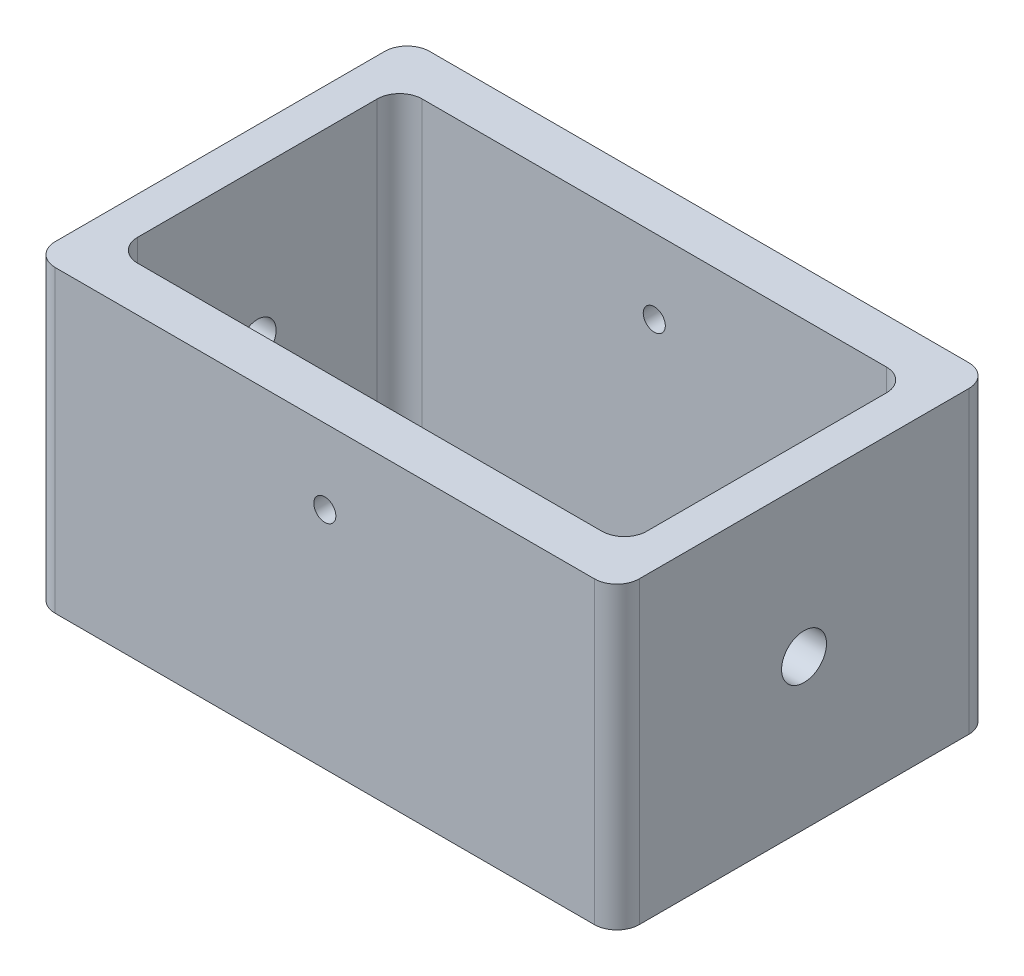
ISO-10303-21;
HEADER;
FILE_DESCRIPTION(('STEP AP214'),'2;1');
FILE_NAME('part.step','',(''),(''),'','','');
FILE_SCHEMA(('AUTOMOTIVE_DESIGN { 1 0 10303 214 1 1 1 1 }'));
ENDSEC;
DATA;
#1=APPLICATION_CONTEXT('core data for automotive mechanical design processes');
#2=APPLICATION_PROTOCOL_DEFINITION('international standard','automotive_design',2000,#1);
#3=PRODUCT_CONTEXT('',#1,'mechanical');
#4=PRODUCT('Part','Part','',(#3));
#5=PRODUCT_RELATED_PRODUCT_CATEGORY('part','',(#4));
#6=PRODUCT_DEFINITION_FORMATION('','',#4);
#7=PRODUCT_DEFINITION_CONTEXT('part definition',#1,'design');
#8=PRODUCT_DEFINITION('design','',#6,#7);
#9=PRODUCT_DEFINITION_SHAPE('','',#8);
#10=(LENGTH_UNIT() NAMED_UNIT(*) SI_UNIT(.MILLI.,.METRE.));
#11=(NAMED_UNIT(*) PLANE_ANGLE_UNIT() SI_UNIT($,.RADIAN.));
#12=(NAMED_UNIT(*) SI_UNIT($,.STERADIAN.) SOLID_ANGLE_UNIT());
#13=UNCERTAINTY_MEASURE_WITH_UNIT(LENGTH_MEASURE(1.E-05),#10,'distance_accuracy_value','');
#14=(GEOMETRIC_REPRESENTATION_CONTEXT(3) GLOBAL_UNCERTAINTY_ASSIGNED_CONTEXT((#13)) GLOBAL_UNIT_ASSIGNED_CONTEXT((#10,
#11,#12)) REPRESENTATION_CONTEXT('',''));
#15=CARTESIAN_POINT('',(0.,0.,0.));
#16=DIRECTION('',(0.,0.,1.));
#17=DIRECTION('',(1.,0.,0.));
#18=AXIS2_PLACEMENT_3D('',#15,#16,#17);
#19=CARTESIAN_POINT('',(0.,40.,0.));
#20=DIRECTION('',(0.,-1.,0.));
#21=DIRECTION('',(0.,0.,-1.));
#22=AXIS2_PLACEMENT_3D('',#19,#20,#21);
#23=PLANE('',#22);
#24=DIRECTION('',(0.,0.,-1.));
#25=VECTOR('',#24,1.);
#26=CARTESIAN_POINT('',(63.5813694545739,40.,-30.2037926413092));
#27=LINE('',#26,#25);
#28=CARTESIAN_POINT('',(63.5813694545739,40.,16.7962073586908));
#29=VERTEX_POINT('',#28);
#30=CARTESIAN_POINT('',(63.5813694545739,40.,-27.2037926413092));
#31=VERTEX_POINT('',#30);
#32=EDGE_CURVE('E346',#29,#31,#27,.T.);
#33=ORIENTED_EDGE('',*,*,#32,.T.);
#34=CARTESIAN_POINT('',(60.5813694545739,40.,-27.2037926413092));
#35=DIRECTION('',(0.,-1.,0.));
#36=DIRECTION('',(0.,0.,-1.));
#37=AXIS2_PLACEMENT_3D('',#34,#35,#36);
#38=CIRCLE('',#37,3.);
#39=CARTESIAN_POINT('',(60.5813694545739,40.,-30.2037926413092));
#40=VERTEX_POINT('',#39);
#41=EDGE_CURVE('E225',#31,#40,#38,.F.);
#42=ORIENTED_EDGE('',*,*,#41,.T.);
#43=DIRECTION('',(-1.,0.,0.));
#44=VECTOR('',#43,1.);
#45=CARTESIAN_POINT('',(-14.4186305454261,40.,-30.2037926413092));
#46=LINE('',#45,#44);
#47=CARTESIAN_POINT('',(-11.4186305454261,40.,-30.2037926413092));
#48=VERTEX_POINT('',#47);
#49=EDGE_CURVE('E180',#40,#48,#46,.T.);
#50=ORIENTED_EDGE('',*,*,#49,.T.);
#51=CARTESIAN_POINT('',(-11.4186305454261,40.,-27.2037926413092));
#52=DIRECTION('',(0.,-1.,0.));
#53=DIRECTION('',(0.,0.,-1.));
#54=AXIS2_PLACEMENT_3D('',#51,#52,#53);
#55=CIRCLE('',#54,3.);
#56=CARTESIAN_POINT('',(-14.4186305454261,40.,-27.2037926413092));
#57=VERTEX_POINT('',#56);
#58=EDGE_CURVE('E222',#48,#57,#55,.F.);
#59=ORIENTED_EDGE('',*,*,#58,.T.);
#60=DIRECTION('',(0.,0.,1.));
#61=VECTOR('',#60,1.);
#62=CARTESIAN_POINT('',(-14.4186305454261,40.,19.7962073586908));
#63=LINE('',#62,#61);
#64=CARTESIAN_POINT('',(-14.4186305454261,40.,16.7962073586908));
#65=VERTEX_POINT('',#64);
#66=EDGE_CURVE('E202',#57,#65,#63,.T.);
#67=ORIENTED_EDGE('',*,*,#66,.T.);
#68=CARTESIAN_POINT('',(-11.4186305454261,40.,16.7962073586908));
#69=DIRECTION('',(0.,-1.,0.));
#70=DIRECTION('',(0.,0.,-1.));
#71=AXIS2_PLACEMENT_3D('',#68,#69,#70);
#72=CIRCLE('',#71,3.);
#73=CARTESIAN_POINT('',(-11.4186305454261,40.,19.7962073586908));
#74=VERTEX_POINT('',#73);
#75=EDGE_CURVE('E219',#65,#74,#72,.F.);
#76=ORIENTED_EDGE('',*,*,#75,.T.);
#77=DIRECTION('',(1.,0.,0.));
#78=VECTOR('',#77,1.);
#79=CARTESIAN_POINT('',(63.5813694545739,40.,19.7962073586908));
#80=LINE('',#79,#78);
#81=CARTESIAN_POINT('',(60.5813694545739,40.,19.7962073586908));
#82=VERTEX_POINT('',#81);
#83=EDGE_CURVE('E195',#74,#82,#80,.T.);
#84=ORIENTED_EDGE('',*,*,#83,.T.);
#85=CARTESIAN_POINT('',(60.5813694545739,40.,16.7962073586908));
#86=DIRECTION('',(0.,-1.,0.));
#87=DIRECTION('',(0.,0.,-1.));
#88=AXIS2_PLACEMENT_3D('',#85,#86,#87);
#89=CIRCLE('',#88,3.);
#90=EDGE_CURVE('E216',#82,#29,#89,.F.);
#91=ORIENTED_EDGE('',*,*,#90,.T.);
#92=EDGE_LOOP('',(#33,#42,#50,#59,#67,#76,#84,#91));
#93=FACE_BOUND('',#92,.T.);
#94=DIRECTION('',(-1.,0.,0.));
#95=VECTOR('',#94,1.);
#96=CARTESIAN_POINT('',(58.5813694545739,40.,-24.2037926413092));
#97=LINE('',#96,#95);
#98=CARTESIAN_POINT('',(55.5813694545739,40.,-24.2037926413092));
#99=VERTEX_POINT('',#98);
#100=CARTESIAN_POINT('',(-6.41863054542609,40.,-24.2037926413092));
#101=VERTEX_POINT('',#100);
#102=EDGE_CURVE('E313',#99,#101,#97,.T.);
#103=ORIENTED_EDGE('',*,*,#102,.F.);
#104=CARTESIAN_POINT('',(55.5813694545739,40.,-21.2037926413092));
#105=DIRECTION('',(0.,-1.,0.));
#106=DIRECTION('',(0.,0.,-1.));
#107=AXIS2_PLACEMENT_3D('',#104,#105,#106);
#108=CIRCLE('',#107,3.);
#109=CARTESIAN_POINT('',(58.5813694545739,40.,-21.2037926413092));
#110=VERTEX_POINT('',#109);
#111=EDGE_CURVE('E272',#99,#110,#108,.T.);
#112=ORIENTED_EDGE('',*,*,#111,.T.);
#113=DIRECTION('',(0.,0.,-1.));
#114=VECTOR('',#113,1.);
#115=CARTESIAN_POINT('',(58.5813694545739,40.,13.7962073586908));
#116=LINE('',#115,#114);
#117=CARTESIAN_POINT('',(58.5813694545739,40.,10.7962073586908));
#118=VERTEX_POINT('',#117);
#119=EDGE_CURVE('E325',#118,#110,#116,.T.);
#120=ORIENTED_EDGE('',*,*,#119,.F.);
#121=CARTESIAN_POINT('',(55.5813694545739,40.,10.7962073586908));
#122=DIRECTION('',(0.,-1.,0.));
#123=DIRECTION('',(0.,0.,-1.));
#124=AXIS2_PLACEMENT_3D('',#121,#122,#123);
#125=CIRCLE('',#124,3.);
#126=CARTESIAN_POINT('',(55.5813694545739,40.,13.7962073586908));
#127=VERTEX_POINT('',#126);
#128=EDGE_CURVE('E11',#118,#127,#125,.T.);
#129=ORIENTED_EDGE('',*,*,#128,.T.);
#130=DIRECTION('',(1.,0.,0.));
#131=VECTOR('',#130,1.);
#132=CARTESIAN_POINT('',(-9.41863054542609,40.,13.7962073586908));
#133=LINE('',#132,#131);
#134=CARTESIAN_POINT('',(-6.41863054542609,40.,13.7962073586908));
#135=VERTEX_POINT('',#134);
#136=EDGE_CURVE('E321',#135,#127,#133,.T.);
#137=ORIENTED_EDGE('',*,*,#136,.F.);
#138=CARTESIAN_POINT('',(-6.41863054542609,40.,10.7962073586908));
#139=DIRECTION('',(0.,-1.,0.));
#140=DIRECTION('',(0.,0.,-1.));
#141=AXIS2_PLACEMENT_3D('',#138,#139,#140);
#142=CIRCLE('',#141,3.);
#143=CARTESIAN_POINT('',(-9.41863054542609,40.,10.7962073586908));
#144=VERTEX_POINT('',#143);
#145=EDGE_CURVE('E60',#135,#144,#142,.T.);
#146=ORIENTED_EDGE('',*,*,#145,.T.);
#147=DIRECTION('',(0.,0.,1.));
#148=VECTOR('',#147,1.);
#149=CARTESIAN_POINT('',(-9.41863054542609,40.,-24.2037926413092));
#150=LINE('',#149,#148);
#151=CARTESIAN_POINT('',(-9.41863054542609,40.,-21.2037926413092));
#152=VERTEX_POINT('',#151);
#153=EDGE_CURVE('E317',#152,#144,#150,.T.);
#154=ORIENTED_EDGE('',*,*,#153,.F.);
#155=CARTESIAN_POINT('',(-6.41863054542609,40.,-21.2037926413092));
#156=DIRECTION('',(0.,-1.,0.));
#157=DIRECTION('',(0.,0.,-1.));
#158=AXIS2_PLACEMENT_3D('',#155,#156,#157);
#159=CIRCLE('',#158,3.);
#160=EDGE_CURVE('E278',#152,#101,#159,.T.);
#161=ORIENTED_EDGE('',*,*,#160,.T.);
#162=EDGE_LOOP('',(#103,#112,#120,#129,#137,#146,#154,#161));
#163=FACE_BOUND('',#162,.T.);
#164=ADVANCED_FACE('F42',(#93,#163),#23,.F.);
#165=CARTESIAN_POINT('',(0.,0.,0.));
#166=DIRECTION('',(0.,-1.,0.));
#167=DIRECTION('',(0.,0.,-1.));
#168=AXIS2_PLACEMENT_3D('',#165,#166,#167);
#169=PLANE('',#168);
#170=DIRECTION('',(-1.,0.,0.));
#171=VECTOR('',#170,1.);
#172=CARTESIAN_POINT('',(-14.4186305454261,0.,-30.2037926413092));
#173=LINE('',#172,#171);
#174=CARTESIAN_POINT('',(60.5813694545739,0.,-30.2037926413092));
#175=VERTEX_POINT('',#174);
#176=CARTESIAN_POINT('',(-11.4186305454261,0.,-30.2037926413092));
#177=VERTEX_POINT('',#176);
#178=EDGE_CURVE('E177',#175,#177,#173,.T.);
#179=ORIENTED_EDGE('',*,*,#178,.F.);
#180=CARTESIAN_POINT('',(60.5813694545739,0.,-27.2037926413092));
#181=DIRECTION('',(0.,-1.,0.));
#182=DIRECTION('',(0.,0.,-1.));
#183=AXIS2_PLACEMENT_3D('',#180,#181,#182);
#184=CIRCLE('',#183,3.);
#185=CARTESIAN_POINT('',(63.5813694545739,0.,-27.2037926413092));
#186=VERTEX_POINT('',#185);
#187=EDGE_CURVE('E159',#175,#186,#184,.T.);
#188=ORIENTED_EDGE('',*,*,#187,.T.);
#189=DIRECTION('',(0.,0.,-1.));
#190=VECTOR('',#189,1.);
#191=CARTESIAN_POINT('',(63.5813694545739,0.,-30.2037926413092));
#192=LINE('',#191,#190);
#193=CARTESIAN_POINT('',(63.5813694545739,0.,16.7962073586908));
#194=VERTEX_POINT('',#193);
#195=EDGE_CURVE('E190',#194,#186,#192,.T.);
#196=ORIENTED_EDGE('',*,*,#195,.F.);
#197=CARTESIAN_POINT('',(60.5813694545739,0.,16.7962073586908));
#198=DIRECTION('',(0.,-1.,0.));
#199=DIRECTION('',(0.,0.,-1.));
#200=AXIS2_PLACEMENT_3D('',#197,#198,#199);
#201=CIRCLE('',#200,3.);
#202=CARTESIAN_POINT('',(60.5813694545739,0.,19.7962073586908));
#203=VERTEX_POINT('',#202);
#204=EDGE_CURVE('E182',#194,#203,#201,.T.);
#205=ORIENTED_EDGE('',*,*,#204,.T.);
#206=DIRECTION('',(1.,0.,0.));
#207=VECTOR('',#206,1.);
#208=CARTESIAN_POINT('',(63.5813694545739,0.,19.7962073586908));
#209=LINE('',#208,#207);
#210=CARTESIAN_POINT('',(-11.4186305454261,0.,19.7962073586908));
#211=VERTEX_POINT('',#210);
#212=EDGE_CURVE('E197',#211,#203,#209,.T.);
#213=ORIENTED_EDGE('',*,*,#212,.F.);
#214=CARTESIAN_POINT('',(-11.4186305454261,0.,16.7962073586908));
#215=DIRECTION('',(0.,-1.,0.));
#216=DIRECTION('',(0.,0.,-1.));
#217=AXIS2_PLACEMENT_3D('',#214,#215,#216);
#218=CIRCLE('',#217,3.);
#219=CARTESIAN_POINT('',(-14.4186305454261,0.,16.7962073586908));
#220=VERTEX_POINT('',#219);
#221=EDGE_CURVE('E206',#211,#220,#218,.T.);
#222=ORIENTED_EDGE('',*,*,#221,.T.);
#223=DIRECTION('',(0.,0.,1.));
#224=VECTOR('',#223,1.);
#225=CARTESIAN_POINT('',(-14.4186305454261,0.,19.7962073586908));
#226=LINE('',#225,#224);
#227=CARTESIAN_POINT('',(-14.4186305454261,0.,-27.2037926413092));
#228=VERTEX_POINT('',#227);
#229=EDGE_CURVE('E189',#228,#220,#226,.T.);
#230=ORIENTED_EDGE('',*,*,#229,.F.);
#231=CARTESIAN_POINT('',(-11.4186305454261,0.,-27.2037926413092));
#232=DIRECTION('',(0.,-1.,0.));
#233=DIRECTION('',(0.,0.,-1.));
#234=AXIS2_PLACEMENT_3D('',#231,#232,#233);
#235=CIRCLE('',#234,3.);
#236=EDGE_CURVE('E171',#228,#177,#235,.T.);
#237=ORIENTED_EDGE('',*,*,#236,.T.);
#238=EDGE_LOOP('',(#179,#188,#196,#205,#213,#222,#230,#237));
#239=FACE_BOUND('',#238,.T.);
#240=DIRECTION('',(1.,0.,0.));
#241=VECTOR('',#240,1.);
#242=CARTESIAN_POINT('',(-9.41863054542609,0.,13.7962073586908));
#243=LINE('',#242,#241);
#244=CARTESIAN_POINT('',(-6.41863054542609,0.,13.7962073586908));
#245=VERTEX_POINT('',#244);
#246=CARTESIAN_POINT('',(55.5813694545739,0.,13.7962073586908));
#247=VERTEX_POINT('',#246);
#248=EDGE_CURVE('E336',#245,#247,#243,.T.);
#249=ORIENTED_EDGE('',*,*,#248,.T.);
#250=CARTESIAN_POINT('',(55.5813694545739,0.,10.7962073586908));
#251=DIRECTION('',(0.,-1.,0.));
#252=DIRECTION('',(0.,0.,-1.));
#253=AXIS2_PLACEMENT_3D('',#250,#251,#252);
#254=CIRCLE('',#253,3.);
#255=CARTESIAN_POINT('',(58.5813694545739,0.,10.7962073586908));
#256=VERTEX_POINT('',#255);
#257=EDGE_CURVE('E52',#247,#256,#254,.F.);
#258=ORIENTED_EDGE('',*,*,#257,.T.);
#259=DIRECTION('',(0.,0.,-1.));
#260=VECTOR('',#259,1.);
#261=CARTESIAN_POINT('',(58.5813694545739,0.,13.7962073586908));
#262=LINE('',#261,#260);
#263=CARTESIAN_POINT('',(58.5813694545739,0.,-21.2037926413092));
#264=VERTEX_POINT('',#263);
#265=EDGE_CURVE('E318',#256,#264,#262,.T.);
#266=ORIENTED_EDGE('',*,*,#265,.T.);
#267=CARTESIAN_POINT('',(55.5813694545739,0.,-21.2037926413092));
#268=DIRECTION('',(0.,-1.,0.));
#269=DIRECTION('',(0.,0.,-1.));
#270=AXIS2_PLACEMENT_3D('',#267,#268,#269);
#271=CIRCLE('',#270,3.);
#272=CARTESIAN_POINT('',(55.5813694545739,0.,-24.2037926413092));
#273=VERTEX_POINT('',#272);
#274=EDGE_CURVE('E269',#264,#273,#271,.F.);
#275=ORIENTED_EDGE('',*,*,#274,.T.);
#276=DIRECTION('',(-1.,0.,0.));
#277=VECTOR('',#276,1.);
#278=CARTESIAN_POINT('',(58.5813694545739,0.,-24.2037926413092));
#279=LINE('',#278,#277);
#280=CARTESIAN_POINT('',(-6.41863054542609,0.,-24.2037926413092));
#281=VERTEX_POINT('',#280);
#282=EDGE_CURVE('E291',#273,#281,#279,.T.);
#283=ORIENTED_EDGE('',*,*,#282,.T.);
#284=CARTESIAN_POINT('',(-6.41863054542609,0.,-21.2037926413092));
#285=DIRECTION('',(0.,-1.,0.));
#286=DIRECTION('',(0.,0.,-1.));
#287=AXIS2_PLACEMENT_3D('',#284,#285,#286);
#288=CIRCLE('',#287,3.);
#289=CARTESIAN_POINT('',(-9.41863054542609,0.,-21.2037926413092));
#290=VERTEX_POINT('',#289);
#291=EDGE_CURVE('E275',#281,#290,#288,.F.);
#292=ORIENTED_EDGE('',*,*,#291,.T.);
#293=DIRECTION('',(0.,0.,1.));
#294=VECTOR('',#293,1.);
#295=CARTESIAN_POINT('',(-9.41863054542609,0.,-24.2037926413092));
#296=LINE('',#295,#294);
#297=CARTESIAN_POINT('',(-9.41863054542609,0.,10.7962073586908));
#298=VERTEX_POINT('',#297);
#299=EDGE_CURVE('E332',#290,#298,#296,.T.);
#300=ORIENTED_EDGE('',*,*,#299,.T.);
#301=CARTESIAN_POINT('',(-6.41863054542609,0.,10.7962073586908));
#302=DIRECTION('',(0.,-1.,0.));
#303=DIRECTION('',(0.,0.,-1.));
#304=AXIS2_PLACEMENT_3D('',#301,#302,#303);
#305=CIRCLE('',#304,3.);
#306=EDGE_CURVE('E281',#298,#245,#305,.F.);
#307=ORIENTED_EDGE('',*,*,#306,.T.);
#308=EDGE_LOOP('',(#249,#258,#266,#275,#283,#292,#300,#307));
#309=FACE_BOUND('',#308,.T.);
#310=ADVANCED_FACE('F185',(#239,#309),#169,.T.);
#311=CARTESIAN_POINT('',(63.5813694545739,40.,19.7962073586908));
#312=DIRECTION('',(0.,0.,-1.));
#313=DIRECTION('',(-1.,0.,0.));
#314=AXIS2_PLACEMENT_3D('',#311,#312,#313);
#315=PLANE('',#314);
#316=CARTESIAN_POINT('',(24.5813694545739,30.,19.7962073586908));
#317=DIRECTION('',(0.,0.,-1.));
#318=DIRECTION('',(-1.,0.,0.));
#319=AXIS2_PLACEMENT_3D('',#316,#317,#318);
#320=CIRCLE('',#319,1.475);
#321=CARTESIAN_POINT('',(23.1063694545739,30.,19.7962073586908));
#322=VERTEX_POINT('',#321);
#323=EDGE_CURVE('E651',#322,#322,#320,.T.);
#324=ORIENTED_EDGE('',*,*,#323,.T.);
#325=EDGE_LOOP('',(#324));
#326=FACE_BOUND('',#325,.T.);
#327=ORIENTED_EDGE('',*,*,#83,.F.);
#328=DIRECTION('',(0.,-1.,0.));
#329=VECTOR('',#328,1.);
#330=CARTESIAN_POINT('',(-11.4186305454261,40.,19.7962073586908));
#331=LINE('',#330,#329);
#332=EDGE_CURVE('E238',#74,#211,#331,.T.);
#333=ORIENTED_EDGE('',*,*,#332,.T.);
#334=ORIENTED_EDGE('',*,*,#212,.T.);
#335=DIRECTION('',(0.,-1.,0.));
#336=VECTOR('',#335,1.);
#337=CARTESIAN_POINT('',(60.5813694545739,40.,19.7962073586908));
#338=LINE('',#337,#336);
#339=EDGE_CURVE('E235',#203,#82,#338,.F.);
#340=ORIENTED_EDGE('',*,*,#339,.T.);
#341=EDGE_LOOP('',(#327,#333,#334,#340));
#342=FACE_BOUND('',#341,.T.);
#343=ADVANCED_FACE('F360',(#326,#342),#315,.F.);
#344=CARTESIAN_POINT('',(63.5813694545739,40.,-30.2037926413092));
#345=DIRECTION('',(-1.,0.,0.));
#346=DIRECTION('',(0.,0.,1.));
#347=AXIS2_PLACEMENT_3D('',#344,#345,#346);
#348=PLANE('',#347);
#349=CARTESIAN_POINT('',(63.5813694545739,20.,-5.20379264130917));
#350=DIRECTION('',(1.,0.,0.));
#351=DIRECTION('',(0.,0.,-1.));
#352=AXIS2_PLACEMENT_3D('',#349,#350,#351);
#353=CIRCLE('',#352,3.);
#354=CARTESIAN_POINT('',(63.5813694545739,20.,-8.20379264130917));
#355=VERTEX_POINT('',#354);
#356=EDGE_CURVE('E292',#355,#355,#353,.T.);
#357=ORIENTED_EDGE('',*,*,#356,.F.);
#358=EDGE_LOOP('',(#357));
#359=FACE_BOUND('',#358,.T.);
#360=ORIENTED_EDGE('',*,*,#195,.T.);
#361=DIRECTION('',(0.,-1.,0.));
#362=VECTOR('',#361,1.);
#363=CARTESIAN_POINT('',(63.5813694545739,40.,-27.2037926413092));
#364=LINE('',#363,#362);
#365=EDGE_CURVE('E164',#186,#31,#364,.F.);
#366=ORIENTED_EDGE('',*,*,#365,.T.);
#367=ORIENTED_EDGE('',*,*,#32,.F.);
#368=DIRECTION('',(0.,-1.,0.));
#369=VECTOR('',#368,1.);
#370=CARTESIAN_POINT('',(63.5813694545739,40.,16.7962073586908));
#371=LINE('',#370,#369);
#372=EDGE_CURVE('E170',#29,#194,#371,.T.);
#373=ORIENTED_EDGE('',*,*,#372,.T.);
#374=EDGE_LOOP('',(#360,#366,#367,#373));
#375=FACE_BOUND('',#374,.T.);
#376=ADVANCED_FACE('F368',(#359,#375),#348,.F.);
#377=CARTESIAN_POINT('',(-14.4186305454261,40.,-30.2037926413092));
#378=DIRECTION('',(0.,0.,1.));
#379=DIRECTION('',(1.,0.,0.));
#380=AXIS2_PLACEMENT_3D('',#377,#378,#379);
#381=PLANE('',#380);
#382=CARTESIAN_POINT('',(24.5813694545739,30.,-30.2037926413092));
#383=DIRECTION('',(0.,0.,-1.));
#384=DIRECTION('',(-1.,0.,0.));
#385=AXIS2_PLACEMENT_3D('',#382,#383,#384);
#386=CIRCLE('',#385,1.475);
#387=CARTESIAN_POINT('',(23.1063694545739,30.,-30.2037926413092));
#388=VERTEX_POINT('',#387);
#389=EDGE_CURVE('E649',#388,#388,#386,.T.);
#390=ORIENTED_EDGE('',*,*,#389,.F.);
#391=EDGE_LOOP('',(#390));
#392=FACE_BOUND('',#391,.T.);
#393=ORIENTED_EDGE('',*,*,#49,.F.);
#394=DIRECTION('',(0.,-1.,0.));
#395=VECTOR('',#394,1.);
#396=CARTESIAN_POINT('',(60.5813694545739,40.,-30.2037926413092));
#397=LINE('',#396,#395);
#398=EDGE_CURVE('E163',#40,#175,#397,.T.);
#399=ORIENTED_EDGE('',*,*,#398,.T.);
#400=ORIENTED_EDGE('',*,*,#178,.T.);
#401=DIRECTION('',(0.,-1.,0.));
#402=VECTOR('',#401,1.);
#403=CARTESIAN_POINT('',(-11.4186305454261,40.,-30.2037926413092));
#404=LINE('',#403,#402);
#405=EDGE_CURVE('E183',#177,#48,#404,.F.);
#406=ORIENTED_EDGE('',*,*,#405,.T.);
#407=EDGE_LOOP('',(#393,#399,#400,#406));
#408=FACE_BOUND('',#407,.T.);
#409=ADVANCED_FACE('F176',(#392,#408),#381,.F.);
#410=CARTESIAN_POINT('',(-14.4186305454261,40.,19.7962073586908));
#411=DIRECTION('',(1.,0.,0.));
#412=DIRECTION('',(0.,0.,-1.));
#413=AXIS2_PLACEMENT_3D('',#410,#411,#412);
#414=PLANE('',#413);
#415=CARTESIAN_POINT('',(-14.4186305454261,20.,-5.20379264130917));
#416=DIRECTION('',(-1.,0.,0.));
#417=DIRECTION('',(0.,0.,1.));
#418=AXIS2_PLACEMENT_3D('',#415,#416,#417);
#419=CIRCLE('',#418,2.5);
#420=CARTESIAN_POINT('',(-14.4186305454261,20.,-2.70379264130917));
#421=VERTEX_POINT('',#420);
#422=EDGE_CURVE('E296',#421,#421,#419,.T.);
#423=ORIENTED_EDGE('',*,*,#422,.F.);
#424=EDGE_LOOP('',(#423));
#425=FACE_BOUND('',#424,.T.);
#426=ORIENTED_EDGE('',*,*,#66,.F.);
#427=DIRECTION('',(0.,-1.,0.));
#428=VECTOR('',#427,1.);
#429=CARTESIAN_POINT('',(-14.4186305454261,40.,-27.2037926413092));
#430=LINE('',#429,#428);
#431=EDGE_CURVE('E231',#57,#228,#430,.T.);
#432=ORIENTED_EDGE('',*,*,#431,.T.);
#433=ORIENTED_EDGE('',*,*,#229,.T.);
#434=DIRECTION('',(0.,-1.,0.));
#435=VECTOR('',#434,1.);
#436=CARTESIAN_POINT('',(-14.4186305454261,40.,16.7962073586908));
#437=LINE('',#436,#435);
#438=EDGE_CURVE('E228',#220,#65,#437,.F.);
#439=ORIENTED_EDGE('',*,*,#438,.T.);
#440=EDGE_LOOP('',(#426,#432,#433,#439));
#441=FACE_BOUND('',#440,.T.);
#442=ADVANCED_FACE('F376',(#425,#441),#414,.F.);
#443=CARTESIAN_POINT('',(58.5813694545739,40.,-24.2037926413092));
#444=DIRECTION('',(0.,0.,1.));
#445=DIRECTION('',(1.,0.,0.));
#446=AXIS2_PLACEMENT_3D('',#443,#444,#445);
#447=PLANE('',#446);
#448=CARTESIAN_POINT('',(24.5813694545739,30.,-24.2037926413092));
#449=DIRECTION('',(0.,0.,1.));
#450=DIRECTION('',(1.,0.,0.));
#451=AXIS2_PLACEMENT_3D('',#448,#449,#450);
#452=CIRCLE('',#451,1.475);
#453=CARTESIAN_POINT('',(26.0563694545739,30.,-24.2037926413092));
#454=VERTEX_POINT('',#453);
#455=EDGE_CURVE('E304',#454,#454,#452,.T.);
#456=ORIENTED_EDGE('',*,*,#455,.F.);
#457=EDGE_LOOP('',(#456));
#458=FACE_BOUND('',#457,.T.);
#459=ORIENTED_EDGE('',*,*,#282,.F.);
#460=DIRECTION('',(0.,-1.,0.));
#461=VECTOR('',#460,1.);
#462=CARTESIAN_POINT('',(55.5813694545739,40.,-24.2037926413092));
#463=LINE('',#462,#461);
#464=EDGE_CURVE('E253',#273,#99,#463,.F.);
#465=ORIENTED_EDGE('',*,*,#464,.T.);
#466=ORIENTED_EDGE('',*,*,#102,.T.);
#467=DIRECTION('',(0.,-1.,0.));
#468=VECTOR('',#467,1.);
#469=CARTESIAN_POINT('',(-6.41863054542609,0.,-24.2037926413092));
#470=LINE('',#469,#468);
#471=EDGE_CURVE('E249',#101,#281,#470,.T.);
#472=ORIENTED_EDGE('',*,*,#471,.T.);
#473=EDGE_LOOP('',(#459,#465,#466,#472));
#474=FACE_BOUND('',#473,.T.);
#475=ADVANCED_FACE('F389',(#458,#474),#447,.T.);
#476=CARTESIAN_POINT('',(-9.41863054542609,40.,-24.2037926413092));
#477=DIRECTION('',(1.,0.,0.));
#478=DIRECTION('',(0.,0.,-1.));
#479=AXIS2_PLACEMENT_3D('',#476,#477,#478);
#480=PLANE('',#479);
#481=CARTESIAN_POINT('',(-9.41863054542609,20.,-5.20379264130917));
#482=DIRECTION('',(1.,0.,0.));
#483=DIRECTION('',(0.,0.,-1.));
#484=AXIS2_PLACEMENT_3D('',#481,#482,#483);
#485=CIRCLE('',#484,2.5);
#486=CARTESIAN_POINT('',(-9.41863054542609,20.,-7.70379264130917));
#487=VERTEX_POINT('',#486);
#488=EDGE_CURVE('E293',#487,#487,#485,.T.);
#489=ORIENTED_EDGE('',*,*,#488,.F.);
#490=EDGE_LOOP('',(#489));
#491=FACE_BOUND('',#490,.T.);
#492=ORIENTED_EDGE('',*,*,#299,.F.);
#493=DIRECTION('',(0.,-1.,0.));
#494=VECTOR('',#493,1.);
#495=CARTESIAN_POINT('',(-9.41863054542609,40.,-21.2037926413092));
#496=LINE('',#495,#494);
#497=EDGE_CURVE('E67',#290,#152,#496,.F.);
#498=ORIENTED_EDGE('',*,*,#497,.T.);
#499=ORIENTED_EDGE('',*,*,#153,.T.);
#500=DIRECTION('',(0.,-1.,0.));
#501=VECTOR('',#500,1.);
#502=CARTESIAN_POINT('',(-9.41863054542609,0.,10.7962073586908));
#503=LINE('',#502,#501);
#504=EDGE_CURVE('E256',#144,#298,#503,.T.);
#505=ORIENTED_EDGE('',*,*,#504,.T.);
#506=EDGE_LOOP('',(#492,#498,#499,#505));
#507=FACE_BOUND('',#506,.T.);
#508=ADVANCED_FACE('F397',(#491,#507),#480,.T.);
#509=CARTESIAN_POINT('',(-9.41863054542609,40.,13.7962073586908));
#510=DIRECTION('',(0.,0.,-1.));
#511=DIRECTION('',(-1.,0.,0.));
#512=AXIS2_PLACEMENT_3D('',#509,#510,#511);
#513=PLANE('',#512);
#514=CARTESIAN_POINT('',(24.5813694545739,30.,13.7962073586908));
#515=DIRECTION('',(0.,0.,-1.));
#516=DIRECTION('',(-1.,0.,0.));
#517=AXIS2_PLACEMENT_3D('',#514,#515,#516);
#518=CIRCLE('',#517,1.475);
#519=CARTESIAN_POINT('',(23.1063694545739,30.,13.7962073586908));
#520=VERTEX_POINT('',#519);
#521=EDGE_CURVE('E46',#520,#520,#518,.T.);
#522=ORIENTED_EDGE('',*,*,#521,.F.);
#523=EDGE_LOOP('',(#522));
#524=FACE_BOUND('',#523,.T.);
#525=ORIENTED_EDGE('',*,*,#248,.F.);
#526=DIRECTION('',(0.,-1.,0.));
#527=VECTOR('',#526,1.);
#528=CARTESIAN_POINT('',(-6.41863054542609,40.,13.7962073586908));
#529=LINE('',#528,#527);
#530=EDGE_CURVE('E266',#245,#135,#529,.F.);
#531=ORIENTED_EDGE('',*,*,#530,.T.);
#532=ORIENTED_EDGE('',*,*,#136,.T.);
#533=DIRECTION('',(0.,-1.,0.));
#534=VECTOR('',#533,1.);
#535=CARTESIAN_POINT('',(55.5813694545739,0.,13.7962073586908));
#536=LINE('',#535,#534);
#537=EDGE_CURVE('E262',#127,#247,#536,.T.);
#538=ORIENTED_EDGE('',*,*,#537,.T.);
#539=EDGE_LOOP('',(#525,#531,#532,#538));
#540=FACE_BOUND('',#539,.T.);
#541=ADVANCED_FACE('F444',(#524,#540),#513,.T.);
#542=CARTESIAN_POINT('',(58.5813694545739,40.,13.7962073586908));
#543=DIRECTION('',(-1.,0.,0.));
#544=DIRECTION('',(0.,0.,1.));
#545=AXIS2_PLACEMENT_3D('',#542,#543,#544);
#546=PLANE('',#545);
#547=CARTESIAN_POINT('',(58.5813694545739,20.,-5.20379264130917));
#548=DIRECTION('',(-1.,0.,0.));
#549=DIRECTION('',(0.,0.,1.));
#550=AXIS2_PLACEMENT_3D('',#547,#548,#549);
#551=CIRCLE('',#550,3.);
#552=CARTESIAN_POINT('',(58.5813694545739,20.,-2.20379264130917));
#553=VERTEX_POINT('',#552);
#554=EDGE_CURVE('E288',#553,#553,#551,.T.);
#555=ORIENTED_EDGE('',*,*,#554,.F.);
#556=EDGE_LOOP('',(#555));
#557=FACE_BOUND('',#556,.T.);
#558=ORIENTED_EDGE('',*,*,#119,.T.);
#559=DIRECTION('',(0.,-1.,0.));
#560=VECTOR('',#559,1.);
#561=CARTESIAN_POINT('',(58.5813694545739,0.,-21.2037926413092));
#562=LINE('',#561,#560);
#563=EDGE_CURVE('E245',#110,#264,#562,.T.);
#564=ORIENTED_EDGE('',*,*,#563,.T.);
#565=ORIENTED_EDGE('',*,*,#265,.F.);
#566=DIRECTION('',(0.,-1.,0.));
#567=VECTOR('',#566,1.);
#568=CARTESIAN_POINT('',(58.5813694545739,40.,10.7962073586908));
#569=LINE('',#568,#567);
#570=EDGE_CURVE('E242',#256,#118,#569,.F.);
#571=ORIENTED_EDGE('',*,*,#570,.T.);
#572=EDGE_LOOP('',(#558,#564,#565,#571));
#573=FACE_BOUND('',#572,.T.);
#574=ADVANCED_FACE('F417',(#557,#573),#546,.T.);
#575=CARTESIAN_POINT('',(60.5813694545739,40.,-27.2037926413092));
#576=DIRECTION('',(0.,-1.,0.));
#577=DIRECTION('',(0.,0.,-1.));
#578=AXIS2_PLACEMENT_3D('',#575,#576,#577);
#579=CYLINDRICAL_SURFACE('',#578,3.);
#580=ORIENTED_EDGE('',*,*,#41,.F.);
#581=ORIENTED_EDGE('',*,*,#365,.F.);
#582=ORIENTED_EDGE('',*,*,#187,.F.);
#583=ORIENTED_EDGE('',*,*,#398,.F.);
#584=EDGE_LOOP('',(#580,#581,#582,#583));
#585=FACE_BOUND('',#584,.T.);
#586=ADVANCED_FACE('F162',(#585),#579,.T.);
#587=CARTESIAN_POINT('',(-11.4186305454261,40.,-27.2037926413092));
#588=DIRECTION('',(0.,-1.,0.));
#589=DIRECTION('',(0.,0.,-1.));
#590=AXIS2_PLACEMENT_3D('',#587,#588,#589);
#591=CYLINDRICAL_SURFACE('',#590,3.);
#592=ORIENTED_EDGE('',*,*,#58,.F.);
#593=ORIENTED_EDGE('',*,*,#405,.F.);
#594=ORIENTED_EDGE('',*,*,#236,.F.);
#595=ORIENTED_EDGE('',*,*,#431,.F.);
#596=EDGE_LOOP('',(#592,#593,#594,#595));
#597=FACE_BOUND('',#596,.T.);
#598=ADVANCED_FACE('F406',(#597),#591,.T.);
#599=CARTESIAN_POINT('',(-11.4186305454261,40.,16.7962073586908));
#600=DIRECTION('',(0.,-1.,0.));
#601=DIRECTION('',(0.,0.,-1.));
#602=AXIS2_PLACEMENT_3D('',#599,#600,#601);
#603=CYLINDRICAL_SURFACE('',#602,3.);
#604=ORIENTED_EDGE('',*,*,#75,.F.);
#605=ORIENTED_EDGE('',*,*,#438,.F.);
#606=ORIENTED_EDGE('',*,*,#221,.F.);
#607=ORIENTED_EDGE('',*,*,#332,.F.);
#608=EDGE_LOOP('',(#604,#605,#606,#607));
#609=FACE_BOUND('',#608,.T.);
#610=ADVANCED_FACE('F408',(#609),#603,.T.);
#611=CARTESIAN_POINT('',(55.5813694545739,40.,-21.2037926413092));
#612=DIRECTION('',(0.,1.,0.));
#613=DIRECTION('',(0.,0.,1.));
#614=AXIS2_PLACEMENT_3D('',#611,#612,#613);
#615=CYLINDRICAL_SURFACE('',#614,3.);
#616=ORIENTED_EDGE('',*,*,#111,.F.);
#617=ORIENTED_EDGE('',*,*,#464,.F.);
#618=ORIENTED_EDGE('',*,*,#274,.F.);
#619=ORIENTED_EDGE('',*,*,#563,.F.);
#620=EDGE_LOOP('',(#616,#617,#618,#619));
#621=FACE_BOUND('',#620,.T.);
#622=ADVANCED_FACE('F414',(#621),#615,.F.);
#623=CARTESIAN_POINT('',(-6.41863054542609,40.,-21.2037926413092));
#624=DIRECTION('',(0.,1.,0.));
#625=DIRECTION('',(0.,0.,1.));
#626=AXIS2_PLACEMENT_3D('',#623,#624,#625);
#627=CYLINDRICAL_SURFACE('',#626,3.);
#628=ORIENTED_EDGE('',*,*,#160,.F.);
#629=ORIENTED_EDGE('',*,*,#497,.F.);
#630=ORIENTED_EDGE('',*,*,#291,.F.);
#631=ORIENTED_EDGE('',*,*,#471,.F.);
#632=EDGE_LOOP('',(#628,#629,#630,#631));
#633=FACE_BOUND('',#632,.T.);
#634=ADVANCED_FACE('F422',(#633),#627,.F.);
#635=CARTESIAN_POINT('',(-6.41863054542609,40.,10.7962073586908));
#636=DIRECTION('',(0.,1.,0.));
#637=DIRECTION('',(0.,0.,1.));
#638=AXIS2_PLACEMENT_3D('',#635,#636,#637);
#639=CYLINDRICAL_SURFACE('',#638,3.);
#640=ORIENTED_EDGE('',*,*,#145,.F.);
#641=ORIENTED_EDGE('',*,*,#530,.F.);
#642=ORIENTED_EDGE('',*,*,#306,.F.);
#643=ORIENTED_EDGE('',*,*,#504,.F.);
#644=EDGE_LOOP('',(#640,#641,#642,#643));
#645=FACE_BOUND('',#644,.T.);
#646=ADVANCED_FACE('F426',(#645),#639,.F.);
#647=CARTESIAN_POINT('',(55.5813694545739,40.,10.7962073586908));
#648=DIRECTION('',(0.,1.,0.));
#649=DIRECTION('',(0.,0.,1.));
#650=AXIS2_PLACEMENT_3D('',#647,#648,#649);
#651=CYLINDRICAL_SURFACE('',#650,3.);
#652=ORIENTED_EDGE('',*,*,#128,.F.);
#653=ORIENTED_EDGE('',*,*,#570,.F.);
#654=ORIENTED_EDGE('',*,*,#257,.F.);
#655=ORIENTED_EDGE('',*,*,#537,.F.);
#656=EDGE_LOOP('',(#652,#653,#654,#655));
#657=FACE_BOUND('',#656,.T.);
#658=ADVANCED_FACE('F429',(#657),#651,.F.);
#659=CARTESIAN_POINT('',(60.5813694545739,40.,16.7962073586908));
#660=DIRECTION('',(0.,-1.,0.));
#661=DIRECTION('',(0.,0.,-1.));
#662=AXIS2_PLACEMENT_3D('',#659,#660,#661);
#663=CYLINDRICAL_SURFACE('',#662,3.);
#664=ORIENTED_EDGE('',*,*,#90,.F.);
#665=ORIENTED_EDGE('',*,*,#339,.F.);
#666=ORIENTED_EDGE('',*,*,#204,.F.);
#667=ORIENTED_EDGE('',*,*,#372,.F.);
#668=EDGE_LOOP('',(#664,#665,#666,#667));
#669=FACE_BOUND('',#668,.T.);
#670=ADVANCED_FACE('F44',(#669),#663,.T.);
#671=CARTESIAN_POINT('',(23.5813694545739,20.,-5.20379264130917));
#672=DIRECTION('',(1.,0.,0.));
#673=DIRECTION('',(0.,0.,-1.));
#674=AXIS2_PLACEMENT_3D('',#671,#672,#673);
#675=CYLINDRICAL_SURFACE('',#674,3.);
#676=ORIENTED_EDGE('',*,*,#554,.T.);
#677=EDGE_LOOP('',(#676));
#678=FACE_BOUND('',#677,.T.);
#679=ORIENTED_EDGE('',*,*,#356,.T.);
#680=EDGE_LOOP('',(#679));
#681=FACE_BOUND('',#680,.T.);
#682=ADVANCED_FACE('F436',(#678,#681),#675,.F.);
#683=CARTESIAN_POINT('',(25.5813694545739,20.,-5.20379264130917));
#684=DIRECTION('',(-1.,0.,0.));
#685=DIRECTION('',(0.,0.,1.));
#686=AXIS2_PLACEMENT_3D('',#683,#684,#685);
#687=CYLINDRICAL_SURFACE('',#686,2.5);
#688=ORIENTED_EDGE('',*,*,#488,.T.);
#689=EDGE_LOOP('',(#688));
#690=FACE_BOUND('',#689,.T.);
#691=ORIENTED_EDGE('',*,*,#422,.T.);
#692=EDGE_LOOP('',(#691));
#693=FACE_BOUND('',#692,.T.);
#694=ADVANCED_FACE('F494',(#690,#693),#687,.F.);
#695=CARTESIAN_POINT('',(24.5813694545739,30.,19.7962073586908));
#696=DIRECTION('',(0.,0.,-1.));
#697=DIRECTION('',(-1.,0.,0.));
#698=AXIS2_PLACEMENT_3D('',#695,#696,#697);
#699=CYLINDRICAL_SURFACE('',#698,1.475);
#700=ORIENTED_EDGE('',*,*,#521,.T.);
#701=EDGE_LOOP('',(#700));
#702=FACE_BOUND('',#701,.T.);
#703=ORIENTED_EDGE('',*,*,#323,.F.);
#704=EDGE_LOOP('',(#703));
#705=FACE_BOUND('',#704,.T.);
#706=ADVANCED_FACE('F488',(#702,#705),#699,.F.);
#707=ORIENTED_EDGE('',*,*,#455,.T.);
#708=EDGE_LOOP('',(#707));
#709=FACE_BOUND('',#708,.T.);
#710=ORIENTED_EDGE('',*,*,#389,.T.);
#711=EDGE_LOOP('',(#710));
#712=FACE_BOUND('',#711,.T.);
#713=ADVANCED_FACE('F493',(#709,#712),#699,.F.);
#714=CLOSED_SHELL('',(#164,#310,#343,#376,#409,#442,#475,#508,#541,#574,#586,#598,#610,#622,
#634,#646,#658,#670,#682,#694,#706,#713));
#715=MANIFOLD_SOLID_BREP('B2',#714);
#716=ADVANCED_BREP_SHAPE_REPRESENTATION('',(#18,#715),#14);
#717=SHAPE_DEFINITION_REPRESENTATION(#9,#716);
ENDSEC;
END-ISO-10303-21;
